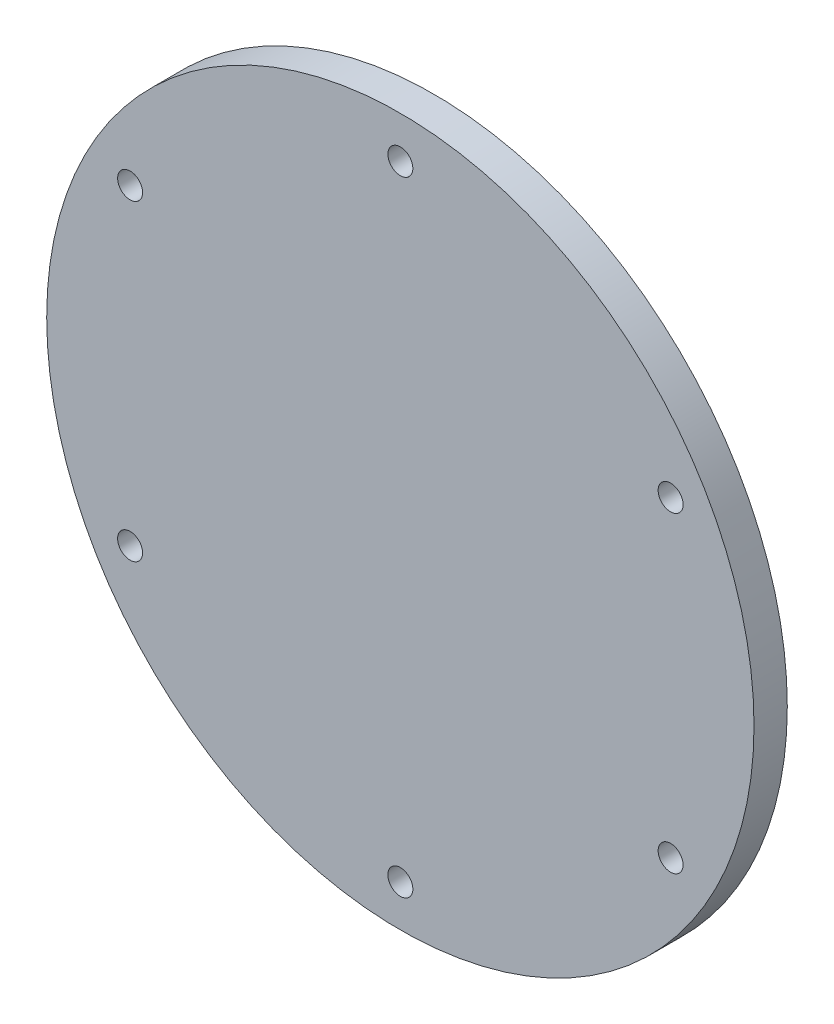
ISO-10303-21;
HEADER;
FILE_DESCRIPTION(('STEP AP214'),'2;1');
FILE_NAME('part.step','',(''),(''),'','','');
FILE_SCHEMA(('AUTOMOTIVE_DESIGN { 1 0 10303 214 1 1 1 1 }'));
ENDSEC;
DATA;
#1=APPLICATION_CONTEXT('core data for automotive mechanical design processes');
#2=APPLICATION_PROTOCOL_DEFINITION('international standard','automotive_design',2000,#1);
#3=PRODUCT_CONTEXT('',#1,'mechanical');
#4=PRODUCT('Part','Part','',(#3));
#5=PRODUCT_RELATED_PRODUCT_CATEGORY('part','',(#4));
#6=PRODUCT_DEFINITION_FORMATION('','',#4);
#7=PRODUCT_DEFINITION_CONTEXT('part definition',#1,'design');
#8=PRODUCT_DEFINITION('design','',#6,#7);
#9=PRODUCT_DEFINITION_SHAPE('','',#8);
#10=(LENGTH_UNIT() NAMED_UNIT(*) SI_UNIT(.MILLI.,.METRE.));
#11=(NAMED_UNIT(*) PLANE_ANGLE_UNIT() SI_UNIT($,.RADIAN.));
#12=(NAMED_UNIT(*) SI_UNIT($,.STERADIAN.) SOLID_ANGLE_UNIT());
#13=UNCERTAINTY_MEASURE_WITH_UNIT(LENGTH_MEASURE(1.E-05),#10,'distance_accuracy_value','');
#14=(GEOMETRIC_REPRESENTATION_CONTEXT(3) GLOBAL_UNCERTAINTY_ASSIGNED_CONTEXT((#13)) GLOBAL_UNIT_ASSIGNED_CONTEXT((#10,
#11,#12)) REPRESENTATION_CONTEXT('',''));
#15=CARTESIAN_POINT('',(0.,0.,0.));
#16=DIRECTION('',(0.,0.,1.));
#17=DIRECTION('',(1.,0.,0.));
#18=AXIS2_PLACEMENT_3D('',#15,#16,#17);
#19=CARTESIAN_POINT('',(0.,0.,8.));
#20=DIRECTION('',(0.,0.,1.));
#21=DIRECTION('',(1.,0.,0.));
#22=AXIS2_PLACEMENT_3D('',#19,#20,#21);
#23=PLANE('',#22);
#24=CARTESIAN_POINT('',(3.95393406087404E-12,-75.,8.));
#25=DIRECTION('',(0.,0.,1.));
#26=DIRECTION('',(1.,0.,0.));
#27=AXIS2_PLACEMENT_3D('',#24,#25,#26);
#28=CIRCLE('',#27,3.);
#29=CARTESIAN_POINT('',(3.00000000000395,-75.,8.));
#30=VERTEX_POINT('',#29);
#31=EDGE_CURVE('E71',#30,#30,#28,.T.);
#32=ORIENTED_EDGE('',*,*,#31,.F.);
#33=EDGE_LOOP('',(#32));
#34=FACE_BOUND('',#33,.T.);
#35=CARTESIAN_POINT('',(64.9519052838339,37.5000000000017,8.));
#36=DIRECTION('',(0.,0.,1.));
#37=DIRECTION('',(1.,0.,0.));
#38=AXIS2_PLACEMENT_3D('',#35,#36,#37);
#39=CIRCLE('',#38,3.00000000000001);
#40=CARTESIAN_POINT('',(67.9519052838339,37.5000000000017,8.));
#41=VERTEX_POINT('',#40);
#42=EDGE_CURVE('E59',#41,#41,#39,.T.);
#43=ORIENTED_EDGE('',*,*,#42,.F.);
#44=EDGE_LOOP('',(#43));
#45=FACE_BOUND('',#44,.T.);
#46=CARTESIAN_POINT('',(0.,75.,8.));
#47=DIRECTION('',(0.,0.,1.));
#48=DIRECTION('',(1.,0.,0.));
#49=AXIS2_PLACEMENT_3D('',#46,#47,#48);
#50=CIRCLE('',#49,3.);
#51=CARTESIAN_POINT('',(3.,75.,8.));
#52=VERTEX_POINT('',#51);
#53=EDGE_CURVE('E48',#52,#52,#50,.T.);
#54=ORIENTED_EDGE('',*,*,#53,.F.);
#55=EDGE_LOOP('',(#54));
#56=FACE_BOUND('',#55,.T.);
#57=CARTESIAN_POINT('',(0.,0.,8.));
#58=DIRECTION('',(0.,0.,1.));
#59=DIRECTION('',(1.,0.,0.));
#60=AXIS2_PLACEMENT_3D('',#57,#58,#59);
#61=CIRCLE('',#60,85.);
#62=CARTESIAN_POINT('',(85.,0.,8.));
#63=VERTEX_POINT('',#62);
#64=EDGE_CURVE('E10',#63,#63,#61,.T.);
#65=ORIENTED_EDGE('',*,*,#64,.T.);
#66=EDGE_LOOP('',(#65));
#67=FACE_BOUND('',#66,.T.);
#68=CARTESIAN_POINT('',(-64.9519052838299,-37.5000000000017,8.));
#69=DIRECTION('',(0.,0.,1.));
#70=DIRECTION('',(1.,0.,0.));
#71=AXIS2_PLACEMENT_3D('',#68,#69,#70);
#72=CIRCLE('',#71,3.);
#73=CARTESIAN_POINT('',(-61.9519052838299,-37.5000000000017,8.));
#74=VERTEX_POINT('',#73);
#75=EDGE_CURVE('E53',#74,#74,#72,.T.);
#76=ORIENTED_EDGE('',*,*,#75,.F.);
#77=EDGE_LOOP('',(#76));
#78=FACE_BOUND('',#77,.T.);
#79=CARTESIAN_POINT('',(64.9519052838359,-37.4999999999983,8.));
#80=DIRECTION('',(0.,0.,1.));
#81=DIRECTION('',(1.,0.,0.));
#82=AXIS2_PLACEMENT_3D('',#79,#80,#81);
#83=CIRCLE('',#82,3.00000000000001);
#84=CARTESIAN_POINT('',(67.9519052838359,-37.4999999999983,8.));
#85=VERTEX_POINT('',#84);
#86=EDGE_CURVE('E65',#85,#85,#83,.T.);
#87=ORIENTED_EDGE('',*,*,#86,.F.);
#88=EDGE_LOOP('',(#87));
#89=FACE_BOUND('',#88,.T.);
#90=CARTESIAN_POINT('',(-64.9519052838319,37.4999999999982,8.));
#91=DIRECTION('',(0.,0.,1.));
#92=DIRECTION('',(1.,0.,0.));
#93=AXIS2_PLACEMENT_3D('',#90,#91,#92);
#94=CIRCLE('',#93,3.);
#95=CARTESIAN_POINT('',(-61.9519052838319,37.4999999999982,8.));
#96=VERTEX_POINT('',#95);
#97=EDGE_CURVE('E77',#96,#96,#94,.T.);
#98=ORIENTED_EDGE('',*,*,#97,.F.);
#99=EDGE_LOOP('',(#98));
#100=FACE_BOUND('',#99,.T.);
#101=ADVANCED_FACE('F37',(#34,#45,#56,#67,#78,#89,#100),#23,.T.);
#102=CARTESIAN_POINT('',(0.,0.,0.));
#103=DIRECTION('',(0.,0.,1.));
#104=DIRECTION('',(1.,0.,0.));
#105=AXIS2_PLACEMENT_3D('',#102,#103,#104);
#106=PLANE('',#105);
#107=CARTESIAN_POINT('',(0.,0.,0.));
#108=DIRECTION('',(0.,0.,1.));
#109=DIRECTION('',(1.,0.,0.));
#110=AXIS2_PLACEMENT_3D('',#107,#108,#109);
#111=CIRCLE('',#110,85.);
#112=CARTESIAN_POINT('',(85.,0.,0.));
#113=VERTEX_POINT('',#112);
#114=EDGE_CURVE('E41',#113,#113,#111,.T.);
#115=ORIENTED_EDGE('',*,*,#114,.F.);
#116=EDGE_LOOP('',(#115));
#117=FACE_BOUND('',#116,.T.);
#118=CARTESIAN_POINT('',(0.,75.,0.));
#119=DIRECTION('',(0.,0.,1.));
#120=DIRECTION('',(1.,0.,0.));
#121=AXIS2_PLACEMENT_3D('',#118,#119,#120);
#122=CIRCLE('',#121,3.);
#123=CARTESIAN_POINT('',(3.,75.,0.));
#124=VERTEX_POINT('',#123);
#125=EDGE_CURVE('E50',#124,#124,#122,.T.);
#126=ORIENTED_EDGE('',*,*,#125,.T.);
#127=EDGE_LOOP('',(#126));
#128=FACE_BOUND('',#127,.T.);
#129=CARTESIAN_POINT('',(-64.9519052838299,-37.5000000000017,0.));
#130=DIRECTION('',(0.,0.,1.));
#131=DIRECTION('',(1.,0.,0.));
#132=AXIS2_PLACEMENT_3D('',#129,#130,#131);
#133=CIRCLE('',#132,3.);
#134=CARTESIAN_POINT('',(-61.9519052838299,-37.5000000000017,0.));
#135=VERTEX_POINT('',#134);
#136=EDGE_CURVE('E56',#135,#135,#133,.T.);
#137=ORIENTED_EDGE('',*,*,#136,.T.);
#138=EDGE_LOOP('',(#137));
#139=FACE_BOUND('',#138,.T.);
#140=CARTESIAN_POINT('',(64.9519052838339,37.5000000000017,0.));
#141=DIRECTION('',(0.,0.,1.));
#142=DIRECTION('',(1.,0.,0.));
#143=AXIS2_PLACEMENT_3D('',#140,#141,#142);
#144=CIRCLE('',#143,3.00000000000001);
#145=CARTESIAN_POINT('',(67.9519052838339,37.5000000000017,0.));
#146=VERTEX_POINT('',#145);
#147=EDGE_CURVE('E62',#146,#146,#144,.T.);
#148=ORIENTED_EDGE('',*,*,#147,.T.);
#149=EDGE_LOOP('',(#148));
#150=FACE_BOUND('',#149,.T.);
#151=CARTESIAN_POINT('',(64.9519052838359,-37.4999999999983,0.));
#152=DIRECTION('',(0.,0.,1.));
#153=DIRECTION('',(1.,0.,0.));
#154=AXIS2_PLACEMENT_3D('',#151,#152,#153);
#155=CIRCLE('',#154,3.00000000000001);
#156=CARTESIAN_POINT('',(67.9519052838359,-37.4999999999983,0.));
#157=VERTEX_POINT('',#156);
#158=EDGE_CURVE('E68',#157,#157,#155,.T.);
#159=ORIENTED_EDGE('',*,*,#158,.T.);
#160=EDGE_LOOP('',(#159));
#161=FACE_BOUND('',#160,.T.);
#162=CARTESIAN_POINT('',(3.95393406087404E-12,-75.,0.));
#163=DIRECTION('',(0.,0.,1.));
#164=DIRECTION('',(1.,0.,0.));
#165=AXIS2_PLACEMENT_3D('',#162,#163,#164);
#166=CIRCLE('',#165,3.);
#167=CARTESIAN_POINT('',(3.00000000000395,-75.,0.));
#168=VERTEX_POINT('',#167);
#169=EDGE_CURVE('E74',#168,#168,#166,.T.);
#170=ORIENTED_EDGE('',*,*,#169,.T.);
#171=EDGE_LOOP('',(#170));
#172=FACE_BOUND('',#171,.T.);
#173=CARTESIAN_POINT('',(-64.9519052838319,37.4999999999982,0.));
#174=DIRECTION('',(0.,0.,1.));
#175=DIRECTION('',(1.,0.,0.));
#176=AXIS2_PLACEMENT_3D('',#173,#174,#175);
#177=CIRCLE('',#176,3.);
#178=CARTESIAN_POINT('',(-61.9519052838319,37.4999999999982,0.));
#179=VERTEX_POINT('',#178);
#180=EDGE_CURVE('E80',#179,#179,#177,.T.);
#181=ORIENTED_EDGE('',*,*,#180,.T.);
#182=EDGE_LOOP('',(#181));
#183=FACE_BOUND('',#182,.T.);
#184=ADVANCED_FACE('F90',(#117,#128,#139,#150,#161,#172,#183),#106,.F.);
#185=CARTESIAN_POINT('',(0.,0.,8.));
#186=DIRECTION('',(0.,0.,-1.));
#187=DIRECTION('',(-1.,0.,0.));
#188=AXIS2_PLACEMENT_3D('',#185,#186,#187);
#189=CYLINDRICAL_SURFACE('',#188,85.);
#190=ORIENTED_EDGE('',*,*,#64,.F.);
#191=EDGE_LOOP('',(#190));
#192=FACE_BOUND('',#191,.T.);
#193=ORIENTED_EDGE('',*,*,#114,.T.);
#194=EDGE_LOOP('',(#193));
#195=FACE_BOUND('',#194,.T.);
#196=ADVANCED_FACE('F39',(#192,#195),#189,.T.);
#197=CARTESIAN_POINT('',(0.,75.,8.));
#198=DIRECTION('',(0.,0.,-1.));
#199=DIRECTION('',(-1.,0.,0.));
#200=AXIS2_PLACEMENT_3D('',#197,#198,#199);
#201=CYLINDRICAL_SURFACE('',#200,3.);
#202=ORIENTED_EDGE('',*,*,#53,.T.);
#203=EDGE_LOOP('',(#202));
#204=FACE_BOUND('',#203,.T.);
#205=ORIENTED_EDGE('',*,*,#125,.F.);
#206=EDGE_LOOP('',(#205));
#207=FACE_BOUND('',#206,.T.);
#208=ADVANCED_FACE('F100',(#204,#207),#201,.F.);
#209=CARTESIAN_POINT('',(-64.9519052838299,-37.5000000000017,8.));
#210=DIRECTION('',(0.,0.,-1.));
#211=DIRECTION('',(-1.,0.,0.));
#212=AXIS2_PLACEMENT_3D('',#209,#210,#211);
#213=CYLINDRICAL_SURFACE('',#212,3.);
#214=ORIENTED_EDGE('',*,*,#75,.T.);
#215=EDGE_LOOP('',(#214));
#216=FACE_BOUND('',#215,.T.);
#217=ORIENTED_EDGE('',*,*,#136,.F.);
#218=EDGE_LOOP('',(#217));
#219=FACE_BOUND('',#218,.T.);
#220=ADVANCED_FACE('F103',(#216,#219),#213,.F.);
#221=CARTESIAN_POINT('',(64.9519052838339,37.5000000000017,8.));
#222=DIRECTION('',(0.,0.,-1.));
#223=DIRECTION('',(-1.,0.,0.));
#224=AXIS2_PLACEMENT_3D('',#221,#222,#223);
#225=CYLINDRICAL_SURFACE('',#224,3.00000000000001);
#226=ORIENTED_EDGE('',*,*,#42,.T.);
#227=EDGE_LOOP('',(#226));
#228=FACE_BOUND('',#227,.T.);
#229=ORIENTED_EDGE('',*,*,#147,.F.);
#230=EDGE_LOOP('',(#229));
#231=FACE_BOUND('',#230,.T.);
#232=ADVANCED_FACE('F107',(#228,#231),#225,.F.);
#233=CARTESIAN_POINT('',(64.9519052838359,-37.4999999999983,8.));
#234=DIRECTION('',(0.,0.,-1.));
#235=DIRECTION('',(-1.,0.,0.));
#236=AXIS2_PLACEMENT_3D('',#233,#234,#235);
#237=CYLINDRICAL_SURFACE('',#236,3.00000000000001);
#238=ORIENTED_EDGE('',*,*,#86,.T.);
#239=EDGE_LOOP('',(#238));
#240=FACE_BOUND('',#239,.T.);
#241=ORIENTED_EDGE('',*,*,#158,.F.);
#242=EDGE_LOOP('',(#241));
#243=FACE_BOUND('',#242,.T.);
#244=ADVANCED_FACE('F111',(#240,#243),#237,.F.);
#245=CARTESIAN_POINT('',(3.95393406087404E-12,-75.,8.));
#246=DIRECTION('',(0.,0.,-1.));
#247=DIRECTION('',(-1.,0.,0.));
#248=AXIS2_PLACEMENT_3D('',#245,#246,#247);
#249=CYLINDRICAL_SURFACE('',#248,3.);
#250=ORIENTED_EDGE('',*,*,#31,.T.);
#251=EDGE_LOOP('',(#250));
#252=FACE_BOUND('',#251,.T.);
#253=ORIENTED_EDGE('',*,*,#169,.F.);
#254=EDGE_LOOP('',(#253));
#255=FACE_BOUND('',#254,.T.);
#256=ADVANCED_FACE('F115',(#252,#255),#249,.F.);
#257=CARTESIAN_POINT('',(-64.9519052838319,37.4999999999982,8.));
#258=DIRECTION('',(0.,0.,-1.));
#259=DIRECTION('',(-1.,0.,0.));
#260=AXIS2_PLACEMENT_3D('',#257,#258,#259);
#261=CYLINDRICAL_SURFACE('',#260,3.);
#262=ORIENTED_EDGE('',*,*,#97,.T.);
#263=EDGE_LOOP('',(#262));
#264=FACE_BOUND('',#263,.T.);
#265=ORIENTED_EDGE('',*,*,#180,.F.);
#266=EDGE_LOOP('',(#265));
#267=FACE_BOUND('',#266,.T.);
#268=ADVANCED_FACE('F86',(#264,#267),#261,.F.);
#269=CLOSED_SHELL('',(#101,#184,#196,#208,#220,#232,#244,#256,#268));
#270=MANIFOLD_SOLID_BREP('B2',#269);
#271=ADVANCED_BREP_SHAPE_REPRESENTATION('',(#18,#270),#14);
#272=SHAPE_DEFINITION_REPRESENTATION(#9,#271);
ENDSEC;
END-ISO-10303-21;
